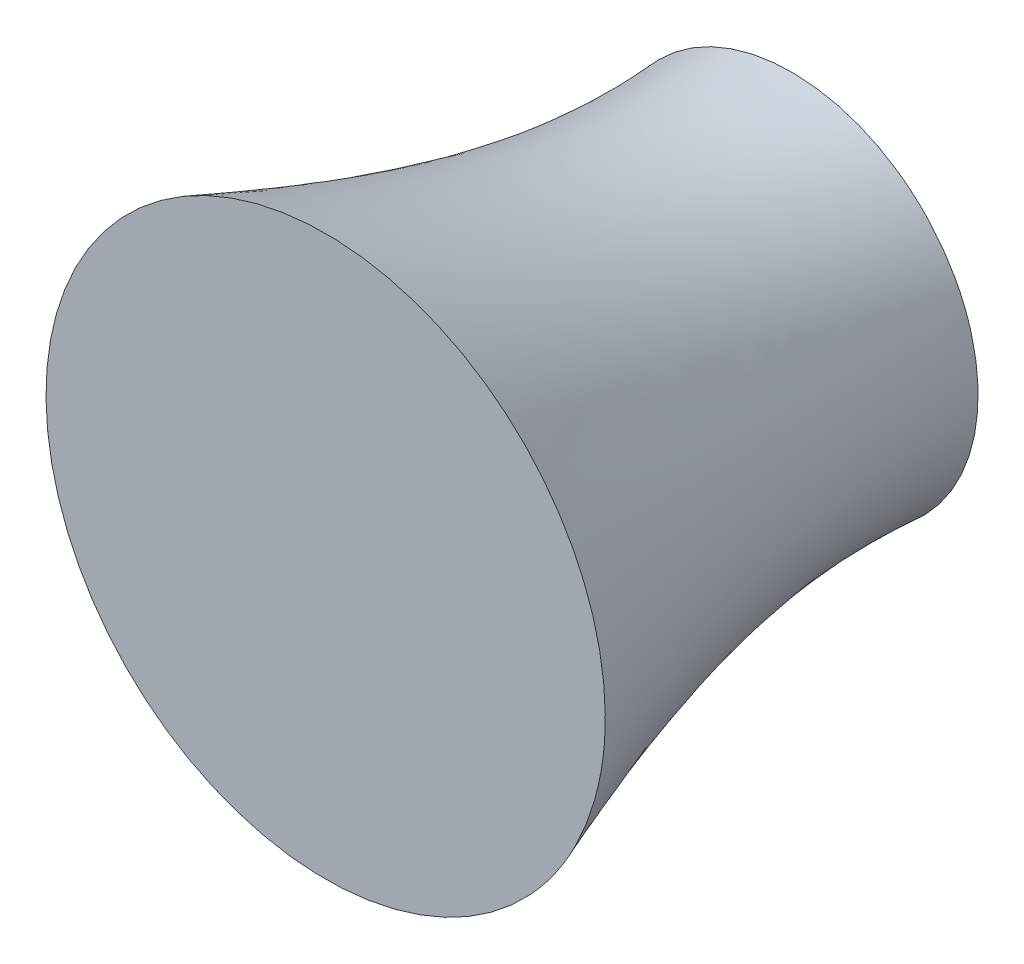
ISO-10303-21;
HEADER;
FILE_DESCRIPTION(('STEP AP214'),'2;1');
FILE_NAME('part.step','',(''),(''),'','','');
FILE_SCHEMA(('AUTOMOTIVE_DESIGN { 1 0 10303 214 1 1 1 1 }'));
ENDSEC;
DATA;
#1=APPLICATION_CONTEXT('core data for automotive mechanical design processes');
#2=APPLICATION_PROTOCOL_DEFINITION('international standard','automotive_design',2000,#1);
#3=PRODUCT_CONTEXT('',#1,'mechanical');
#4=PRODUCT('Part','Part','',(#3));
#5=PRODUCT_RELATED_PRODUCT_CATEGORY('part','',(#4));
#6=PRODUCT_DEFINITION_FORMATION('','',#4);
#7=PRODUCT_DEFINITION_CONTEXT('part definition',#1,'design');
#8=PRODUCT_DEFINITION('design','',#6,#7);
#9=PRODUCT_DEFINITION_SHAPE('','',#8);
#10=(LENGTH_UNIT() NAMED_UNIT(*) SI_UNIT(.MILLI.,.METRE.));
#11=(NAMED_UNIT(*) PLANE_ANGLE_UNIT() SI_UNIT($,.RADIAN.));
#12=(NAMED_UNIT(*) SI_UNIT($,.STERADIAN.) SOLID_ANGLE_UNIT());
#13=UNCERTAINTY_MEASURE_WITH_UNIT(LENGTH_MEASURE(1.E-05),#10,'distance_accuracy_value','');
#14=(GEOMETRIC_REPRESENTATION_CONTEXT(3) GLOBAL_UNCERTAINTY_ASSIGNED_CONTEXT((#13)) GLOBAL_UNIT_ASSIGNED_CONTEXT((#10,
#11,#12)) REPRESENTATION_CONTEXT('',''));
#15=CARTESIAN_POINT('',(0.,0.,0.));
#16=DIRECTION('',(0.,0.,1.));
#17=DIRECTION('',(1.,0.,0.));
#18=AXIS2_PLACEMENT_3D('',#15,#16,#17);
#19=CARTESIAN_POINT('',(0.,0.,0.));
#20=DIRECTION('',(0.,0.,1.));
#21=DIRECTION('',(1.,0.,0.));
#22=AXIS2_PLACEMENT_3D('',#19,#20,#21);
#23=PLANE('',#22);
#24=CARTESIAN_POINT('',(0.,0.,0.));
#25=DIRECTION('',(0.,0.,1.));
#26=DIRECTION('',(1.,0.,0.));
#27=AXIS2_PLACEMENT_3D('',#24,#25,#26);
#28=CIRCLE('',#27,20.);
#29=CARTESIAN_POINT('',(-16.2685150602994,-11.6333751651364,0.));
#30=VERTEX_POINT('',#29);
#31=EDGE_CURVE('E11',#30,#30,#28,.T.);
#32=ORIENTED_EDGE('',*,*,#31,.F.);
#33=EDGE_LOOP('',(#32));
#34=FACE_BOUND('',#33,.T.);
#35=ADVANCED_FACE('F45',(#34),#23,.F.);
#36=CARTESIAN_POINT('',(0.,0.,50.));
#37=DIRECTION('',(0.,0.,1.));
#38=DIRECTION('',(1.,0.,0.));
#39=AXIS2_PLACEMENT_3D('',#36,#37,#38);
#40=PLANE('',#39);
#41=CARTESIAN_POINT('',(0.,0.,50.));
#42=DIRECTION('',(0.,0.,1.));
#43=DIRECTION('',(1.,0.,0.));
#44=AXIS2_PLACEMENT_3D('',#41,#42,#43);
#45=CIRCLE('',#44,30.);
#46=CARTESIAN_POINT('',(-27.9757687517066,10.8331141760363,50.));
#47=VERTEX_POINT('',#46);
#48=EDGE_CURVE('E54',#47,#47,#45,.T.);
#49=ORIENTED_EDGE('',*,*,#48,.T.);
#50=EDGE_LOOP('',(#49));
#51=FACE_BOUND('',#50,.T.);
#52=ADVANCED_FACE('F79',(#51),#40,.T.);
#53=CARTESIAN_POINT('',(-27.9757687517066,10.8331141760363,50.));
#54=CARTESIAN_POINT('',(-16.2685150602994,-11.6333751651364,0.));
#55=CARTESIAN_POINT('',(-6.30954039963392,66.7846516794494,50.));
#56=CARTESIAN_POINT('',(-39.5352653905722,20.9036549554623,0.));
#57=CARTESIAN_POINT('',(49.6419971037792,45.1184233273768,50.));
#58=CARTESIAN_POINT('',(-6.99823526997347,44.1704052857351,0.));
#59=CARTESIAN_POINT('',(27.9757687517066,-10.8331141760363,50.));
#60=CARTESIAN_POINT('',(16.2685150602994,11.6333751651364,0.));
#61=CARTESIAN_POINT('',(6.30954039963391,-66.7846516794494,50.));
#62=CARTESIAN_POINT('',(39.5352653905722,-20.9036549554623,0.));
#63=CARTESIAN_POINT('',(-49.6419971037792,-45.1184233273768,50.));
#64=CARTESIAN_POINT('',(6.99823526997345,-44.1704052857352,0.));
#65=CARTESIAN_POINT('',(-27.9757687517066,10.8331141760363,50.));
#66=CARTESIAN_POINT('',(-16.2685150602994,-11.6333751651364,0.));
#67=(BOUNDED_SURFACE() B_SPLINE_SURFACE(3,1,((#53,#54),(#55,#56),(#57,#58),(#59,#60),(#61,#62),
(#63,#64),(#65,#66)),.UNSPECIFIED.,.T.,.F.,.F.) B_SPLINE_SURFACE_WITH_KNOTS((4,3,4),(2,2),(0.,
0.5,1.),(0.,1.),.UNSPECIFIED.) GEOMETRIC_REPRESENTATION_ITEM() RATIONAL_B_SPLINE_SURFACE(((1.,
1.),(0.333333333333333,0.333333333333333),(0.333333333333333,0.333333333333333),(1.,1.),
(0.333333333333333,0.333333333333333),(0.333333333333333,0.333333333333333),(1.,1.))) REPRESENTATION_ITEM('') SURFACE());
#68=CARTESIAN_POINT('',(-27.9757687517066,10.8331141760363,50.));
#69=CARTESIAN_POINT('',(-27.8538181924211,10.5990882453991,49.4791666666667));
#70=CARTESIAN_POINT('',(-27.7318676331356,10.3650623147619,48.9583333333333));
#71=CARTESIAN_POINT('',(-27.4879665145646,9.89701045348746,47.9166666666667));
#72=CARTESIAN_POINT('',(-27.3660159552791,9.66298452285024,47.3958333333333));
#73=CARTESIAN_POINT('',(-27.1221148367081,9.19493266157581,46.3541666666667));
#74=CARTESIAN_POINT('',(-27.0001642774226,8.96090673093859,45.8333333333333));
#75=CARTESIAN_POINT('',(-26.7562631588516,8.49285486966416,44.7916666666667));
#76=CARTESIAN_POINT('',(-26.6343125995662,8.25882893902694,44.2708333333333));
#77=CARTESIAN_POINT('',(-26.3904114809952,7.79077707775251,43.2291666666667));
#78=CARTESIAN_POINT('',(-26.2684609217097,7.5567511471153,42.7083333333333));
#79=CARTESIAN_POINT('',(-26.0245598031387,7.08869928584086,41.6666666666667));
#80=CARTESIAN_POINT('',(-25.9026092438532,6.85467335520365,41.1458333333333));
#81=CARTESIAN_POINT('',(-25.6587081252822,6.38662149392921,40.1041666666667));
#82=CARTESIAN_POINT('',(-25.5367575659967,6.152595563292,39.5833333333333));
#83=CARTESIAN_POINT('',(-25.2928564474257,5.68454370201757,38.5416666666667));
#84=CARTESIAN_POINT('',(-25.1709058881403,5.45051777138035,38.0208333333333));
#85=CARTESIAN_POINT('',(-24.9270047695693,4.98246591010592,36.9791666666667));
#86=CARTESIAN_POINT('',(-24.8050542102838,4.7484399794687,36.4583333333333));
#87=CARTESIAN_POINT('',(-24.5611530917128,4.28038811819427,35.4166666666667));
#88=CARTESIAN_POINT('',(-24.4392025324273,4.04636218755706,34.8958333333333));
#89=CARTESIAN_POINT('',(-24.1953014138563,3.57831032628262,33.8541666666667));
#90=CARTESIAN_POINT('',(-24.0733508545708,3.34428439564541,33.3333333333333));
#91=CARTESIAN_POINT('',(-23.8294497359998,2.87623253437098,32.2916666666667));
#92=CARTESIAN_POINT('',(-23.7074991767144,2.64220660373376,31.7708333333333));
#93=CARTESIAN_POINT('',(-23.4635980581434,2.17415474245933,30.7291666666667));
#94=CARTESIAN_POINT('',(-23.3416474988579,1.94012881182211,30.2083333333333));
#95=CARTESIAN_POINT('',(-23.0977463802869,1.47207695054768,29.1666666666667));
#96=CARTESIAN_POINT('',(-22.9757958210014,1.23805101991046,28.6458333333333));
#97=CARTESIAN_POINT('',(-22.7318947024304,0.769999158636032,27.6041666666667));
#98=CARTESIAN_POINT('',(-22.6099441431449,0.535973227998816,27.0833333333333));
#99=CARTESIAN_POINT('',(-22.3660430245739,0.0679213667243837,26.0416666666667));
#100=CARTESIAN_POINT('',(-22.2440924652885,-0.166104563912832,25.5208333333333));
#101=CARTESIAN_POINT('',(-22.0001913467175,-0.634156425187264,24.4791666666667));
#102=CARTESIAN_POINT('',(-21.878240787432,-0.86818235582448,23.9583333333333));
#103=CARTESIAN_POINT('',(-21.634339668861,-1.33623421709891,22.9166666666667));
#104=CARTESIAN_POINT('',(-21.5123891095755,-1.57026014773613,22.3958333333333));
#105=CARTESIAN_POINT('',(-21.2684879910045,-2.03831200901056,21.3541666666667));
#106=CARTESIAN_POINT('',(-21.146537431719,-2.27233793964778,20.8333333333333));
#107=CARTESIAN_POINT('',(-20.902636313148,-2.74038980092221,19.7916666666667));
#108=CARTESIAN_POINT('',(-20.7806857538626,-2.97441573155942,19.2708333333333));
#109=CARTESIAN_POINT('',(-20.5367846352916,-3.44246759283386,18.2291666666667));
#110=CARTESIAN_POINT('',(-20.4148340760061,-3.67649352347107,17.7083333333333));
#111=CARTESIAN_POINT('',(-20.1709329574351,-4.1445453847455,16.6666666666667));
#112=CARTESIAN_POINT('',(-20.0489823981496,-4.37857131538272,16.1458333333333));
#113=CARTESIAN_POINT('',(-19.8050812795786,-4.84662317665715,15.1041666666667));
#114=CARTESIAN_POINT('',(-19.6831307202931,-5.08064910729437,14.5833333333333));
#115=CARTESIAN_POINT('',(-19.4392296017221,-5.5487009685688,13.5416666666667));
#116=CARTESIAN_POINT('',(-19.3172790424367,-5.78272689920602,13.0208333333333));
#117=CARTESIAN_POINT('',(-19.0733779238657,-6.25077876048045,11.9791666666667));
#118=CARTESIAN_POINT('',(-18.9514273645802,-6.48480469111766,11.4583333333333));
#119=CARTESIAN_POINT('',(-18.7075262460092,-6.9528565523921,10.4166666666667));
#120=CARTESIAN_POINT('',(-18.5855756867237,-7.18688248302931,9.89583333333333));
#121=CARTESIAN_POINT('',(-18.3416745681527,-7.65493434430374,8.85416666666667));
#122=CARTESIAN_POINT('',(-18.2197240088672,-7.88896027494096,8.33333333333333));
#123=CARTESIAN_POINT('',(-17.9758228902962,-8.35701213621539,7.29166666666667));
#124=CARTESIAN_POINT('',(-17.8538723310108,-8.59103806685261,6.77083333333333));
#125=CARTESIAN_POINT('',(-17.6099712124398,-9.05908992812704,5.72916666666667));
#126=CARTESIAN_POINT('',(-17.4880206531543,-9.29311585876425,5.20833333333333));
#127=CARTESIAN_POINT('',(-17.2441195345833,-9.76116772003869,4.16666666666667));
#128=CARTESIAN_POINT('',(-17.1221689752978,-9.9951936506759,3.64583333333333));
#129=CARTESIAN_POINT('',(-16.8782678567268,-10.4632455119503,2.60416666666667));
#130=CARTESIAN_POINT('',(-16.7563172974413,-10.6972714425876,2.08333333333333));
#131=CARTESIAN_POINT('',(-16.5124161788703,-11.165323303862,1.04166666666667));
#132=CARTESIAN_POINT('',(-16.3904656195849,-11.3993492344992,0.520833333333333));
#133=CARTESIAN_POINT('',(-16.2685150602994,-11.6333751651364,0.));
#134=B_SPLINE_CURVE_WITH_KNOTS('',3,(#68,#69,#70,#71,#72,#73,#74,#75,#76,#77,#78,#79,#80,#81,
#82,#83,#84,#85,#86,#87,#88,#89,#90,#91,#92,#93,#94,#95,#96,#97,#98,#99,#100,#101,#102,#103,
#104,#105,#106,#107,#108,#109,#110,#111,#112,#113,#114,#115,#116,#117,#118,#119,#120,#121,#122,
#123,#124,#125,#126,#127,#128,#129,#130,#131,#132,#133),.UNSPECIFIED.,.F.,.F.,(4,2,2,2,2,2,2,2,
2,2,2,2,2,2,2,2,2,2,2,2,2,2,2,2,2,2,2,2,2,2,2,2,4),(0.,1.75161837341527,3.50323674683053,
5.25485512024579,7.00647349366105,8.75809186707632,10.5097102404916,12.2613286139068,
14.0129469873221,15.7645653607374,17.5161837341526,19.2678021075679,21.0194204809832,
22.7710388543984,24.5226572278137,26.2742756012289,28.0258939746442,29.7775123480595,
31.5291307214747,33.28074909489,35.0323674683053,36.7839858417205,38.5356042151358,
40.2872225885511,42.0388409619663,43.7904593353816,45.5420777087968,47.2936960822121,
49.0453144556274,50.7969328290426,52.5485512024579,54.3001695758732,56.0517879492884),.UNSPECIFIED.);
#135=EDGE_CURVE('BSEAM87',#47,#30,#134,.T.);
#136=ORIENTED_EDGE('',*,*,#48,.F.);
#137=ORIENTED_EDGE('',*,*,#31,.T.);
#138=ORIENTED_EDGE('',*,*,#135,.T.);
#139=ORIENTED_EDGE('',*,*,#135,.F.);
#140=EDGE_LOOP('',(#136,#138,#137,#139));
#141=FACE_BOUND('',#140,.T.);
#142=ADVANCED_FACE('F87',(#141),#67,.T.);
#143=CLOSED_SHELL('',(#35,#52,#142));
#144=MANIFOLD_SOLID_BREP('B2',#143);
#145=ADVANCED_BREP_SHAPE_REPRESENTATION('',(#18,#144),#14);
#146=SHAPE_DEFINITION_REPRESENTATION(#9,#145);
ENDSEC;
END-ISO-10303-21;
